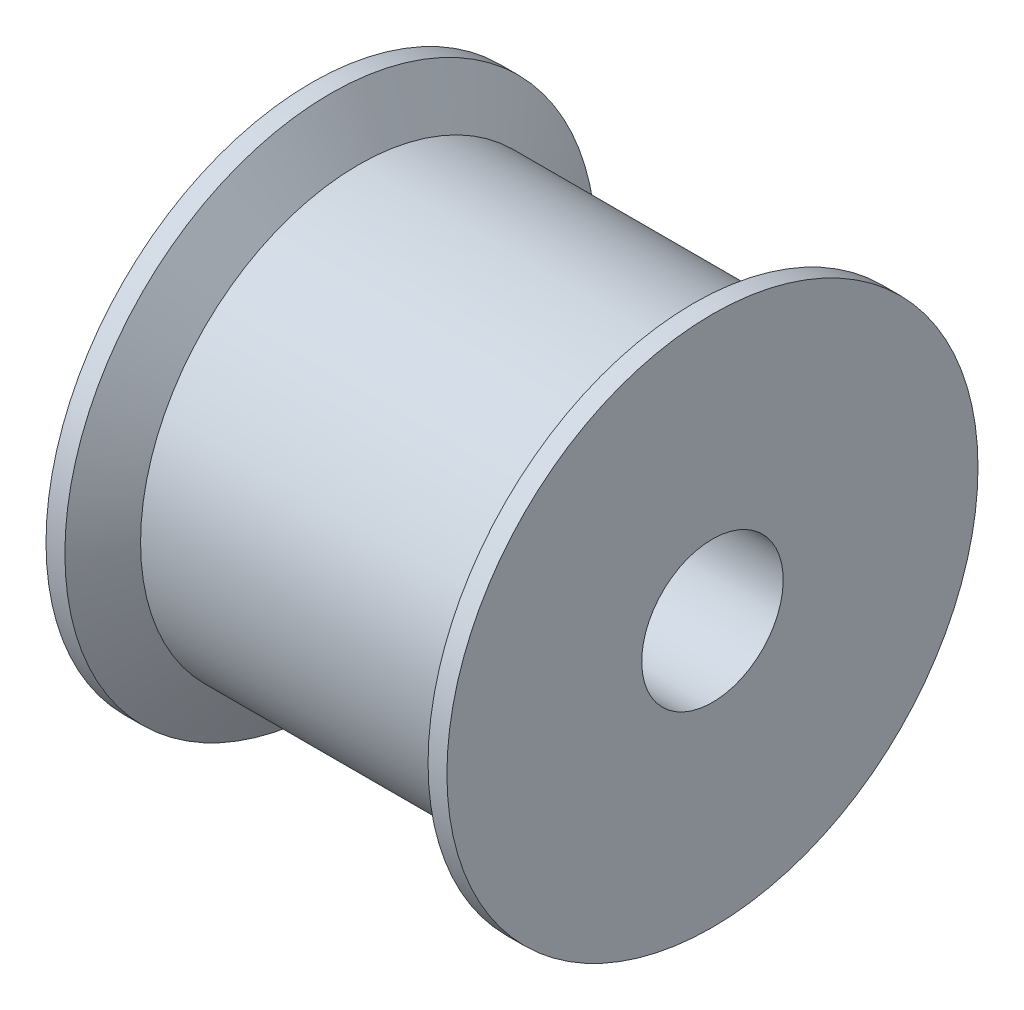
ISO-10303-21;
HEADER;
FILE_DESCRIPTION(('STEP AP214'),'2;1');
FILE_NAME('part.step','',(''),(''),'','','');
FILE_SCHEMA(('AUTOMOTIVE_DESIGN { 1 0 10303 214 1 1 1 1 }'));
ENDSEC;
DATA;
#1=APPLICATION_CONTEXT('core data for automotive mechanical design processes');
#2=APPLICATION_PROTOCOL_DEFINITION('international standard','automotive_design',2000,#1);
#3=PRODUCT_CONTEXT('',#1,'mechanical');
#4=PRODUCT('Part','Part','',(#3));
#5=PRODUCT_RELATED_PRODUCT_CATEGORY('part','',(#4));
#6=PRODUCT_DEFINITION_FORMATION('','',#4);
#7=PRODUCT_DEFINITION_CONTEXT('part definition',#1,'design');
#8=PRODUCT_DEFINITION('design','',#6,#7);
#9=PRODUCT_DEFINITION_SHAPE('','',#8);
#10=(LENGTH_UNIT() NAMED_UNIT(*) SI_UNIT(.MILLI.,.METRE.));
#11=(NAMED_UNIT(*) PLANE_ANGLE_UNIT() SI_UNIT($,.RADIAN.));
#12=(NAMED_UNIT(*) SI_UNIT($,.STERADIAN.) SOLID_ANGLE_UNIT());
#13=UNCERTAINTY_MEASURE_WITH_UNIT(LENGTH_MEASURE(1.E-05),#10,'distance_accuracy_value','');
#14=(GEOMETRIC_REPRESENTATION_CONTEXT(3) GLOBAL_UNCERTAINTY_ASSIGNED_CONTEXT((#13)) GLOBAL_UNIT_ASSIGNED_CONTEXT((#10,
#11,#12)) REPRESENTATION_CONTEXT('',''));
#15=CARTESIAN_POINT('',(0.,0.,0.));
#16=DIRECTION('',(0.,0.,1.));
#17=DIRECTION('',(1.,0.,0.));
#18=AXIS2_PLACEMENT_3D('',#15,#16,#17);
#19=CARTESIAN_POINT('',(0.,4.7352339497636,0.));
#20=DIRECTION('',(1.,0.,0.));
#21=DIRECTION('',(0.,1.,0.));
#22=AXIS2_PLACEMENT_3D('',#19,#20,#21);
#23=PLANE('',#22);
#24=CARTESIAN_POINT('',(0.,-0.894766050236404,0.));
#25=DIRECTION('',(1.,0.,0.));
#26=DIRECTION('',(0.,1.,0.));
#27=AXIS2_PLACEMENT_3D('',#24,#25,#26);
#28=CIRCLE('',#27,5.63);
#29=CARTESIAN_POINT('',(0.,4.7352339497636,0.));
#30=VERTEX_POINT('',#29);
#31=EDGE_CURVE('E10',#30,#30,#28,.T.);
#32=ORIENTED_EDGE('',*,*,#31,.T.);
#33=EDGE_LOOP('',(#32));
#34=FACE_BOUND('',#33,.T.);
#35=CARTESIAN_POINT('',(0.,-0.894766050236404,0.));
#36=DIRECTION('',(1.,0.,0.));
#37=DIRECTION('',(0.,1.,0.));
#38=AXIS2_PLACEMENT_3D('',#35,#36,#37);
#39=CIRCLE('',#38,1.5);
#40=CARTESIAN_POINT('',(0.,0.605233949763595,0.));
#41=VERTEX_POINT('',#40);
#42=EDGE_CURVE('E59',#41,#41,#39,.T.);
#43=ORIENTED_EDGE('',*,*,#42,.F.);
#44=EDGE_LOOP('',(#43));
#45=FACE_BOUND('',#44,.T.);
#46=ADVANCED_FACE('F31',(#34,#45),#23,.T.);
#47=CARTESIAN_POINT('',(10.310000758262,-0.894766050236403,0.));
#48=DIRECTION('',(1.,0.,0.));
#49=DIRECTION('',(0.,1.,0.));
#50=AXIS2_PLACEMENT_3D('',#47,#48,#49);
#51=CYLINDRICAL_SURFACE('',#50,5.63);
#52=CARTESIAN_POINT('',(-0.399999999999999,-0.894766050236404,0.));
#53=DIRECTION('',(1.,0.,0.));
#54=DIRECTION('',(0.,1.,0.));
#55=AXIS2_PLACEMENT_3D('',#52,#53,#54);
#56=CIRCLE('',#55,5.63);
#57=CARTESIAN_POINT('',(-0.4,4.7352339497636,0.));
#58=VERTEX_POINT('',#57);
#59=EDGE_CURVE('E37',#58,#58,#56,.T.);
#60=ORIENTED_EDGE('',*,*,#59,.T.);
#61=EDGE_LOOP('',(#60));
#62=FACE_BOUND('',#61,.T.);
#63=ORIENTED_EDGE('',*,*,#31,.F.);
#64=EDGE_LOOP('',(#63));
#65=FACE_BOUND('',#64,.T.);
#66=ADVANCED_FACE('F67',(#62,#65),#51,.T.);
#67=CARTESIAN_POINT('',(-0.399999999999999,-0.894766050236404,0.));
#68=DIRECTION('',(1.,0.,0.));
#69=DIRECTION('',(0.,1.,0.));
#70=AXIS2_PLACEMENT_3D('',#67,#68,#69);
#71=CONICAL_SURFACE('',#70,5.63,1.03257462518342);
#72=CARTESIAN_POINT('',(-1.,-0.894766050236404,0.));
#73=DIRECTION('',(1.,0.,0.));
#74=DIRECTION('',(0.,1.,0.));
#75=AXIS2_PLACEMENT_3D('',#72,#73,#74);
#76=CIRCLE('',#75,4.625);
#77=CARTESIAN_POINT('',(-1.,3.7302339497636,0.));
#78=VERTEX_POINT('',#77);
#79=EDGE_CURVE('E41',#78,#78,#76,.T.);
#80=ORIENTED_EDGE('',*,*,#79,.T.);
#81=EDGE_LOOP('',(#80));
#82=FACE_BOUND('',#81,.T.);
#83=ORIENTED_EDGE('',*,*,#59,.F.);
#84=EDGE_LOOP('',(#83));
#85=FACE_BOUND('',#84,.T.);
#86=ADVANCED_FACE('F71',(#82,#85),#71,.T.);
#87=CARTESIAN_POINT('',(10.310000758262,-0.894766050236403,0.));
#88=DIRECTION('',(1.,0.,0.));
#89=DIRECTION('',(0.,1.,0.));
#90=AXIS2_PLACEMENT_3D('',#87,#88,#89);
#91=CYLINDRICAL_SURFACE('',#90,4.625);
#92=CARTESIAN_POINT('',(-7.5,-0.894766050236405,0.));
#93=DIRECTION('',(1.,0.,0.));
#94=DIRECTION('',(0.,1.,0.));
#95=AXIS2_PLACEMENT_3D('',#92,#93,#94);
#96=CIRCLE('',#95,4.625);
#97=CARTESIAN_POINT('',(-7.5,3.7302339497636,0.));
#98=VERTEX_POINT('',#97);
#99=EDGE_CURVE('E45',#98,#98,#96,.T.);
#100=ORIENTED_EDGE('',*,*,#99,.T.);
#101=EDGE_LOOP('',(#100));
#102=FACE_BOUND('',#101,.T.);
#103=ORIENTED_EDGE('',*,*,#79,.F.);
#104=EDGE_LOOP('',(#103));
#105=FACE_BOUND('',#104,.T.);
#106=ADVANCED_FACE('F75',(#102,#105),#91,.T.);
#107=CARTESIAN_POINT('',(-7.5,-0.894766050236405,0.));
#108=DIRECTION('',(-1.,0.,0.));
#109=DIRECTION('',(0.,-1.,0.));
#110=AXIS2_PLACEMENT_3D('',#107,#108,#109);
#111=CONICAL_SURFACE('',#110,4.625,1.03257462518342);
#112=CARTESIAN_POINT('',(-8.1,-0.894766050236405,0.));
#113=DIRECTION('',(1.,0.,0.));
#114=DIRECTION('',(0.,1.,0.));
#115=AXIS2_PLACEMENT_3D('',#112,#113,#114);
#116=CIRCLE('',#115,5.63);
#117=CARTESIAN_POINT('',(-8.1,4.73523394976359,0.));
#118=VERTEX_POINT('',#117);
#119=EDGE_CURVE('E50',#118,#118,#116,.T.);
#120=ORIENTED_EDGE('',*,*,#119,.T.);
#121=EDGE_LOOP('',(#120));
#122=FACE_BOUND('',#121,.T.);
#123=ORIENTED_EDGE('',*,*,#99,.F.);
#124=EDGE_LOOP('',(#123));
#125=FACE_BOUND('',#124,.T.);
#126=ADVANCED_FACE('F82',(#122,#125),#111,.T.);
#127=CARTESIAN_POINT('',(10.310000758262,-0.894766050236403,0.));
#128=DIRECTION('',(1.,0.,0.));
#129=DIRECTION('',(0.,1.,0.));
#130=AXIS2_PLACEMENT_3D('',#127,#128,#129);
#131=CYLINDRICAL_SURFACE('',#130,5.63);
#132=CARTESIAN_POINT('',(-8.5,-0.894766050236405,0.));
#133=DIRECTION('',(1.,0.,0.));
#134=DIRECTION('',(0.,1.,0.));
#135=AXIS2_PLACEMENT_3D('',#132,#133,#134);
#136=CIRCLE('',#135,5.63);
#137=CARTESIAN_POINT('',(-8.5,4.73523394976359,0.));
#138=VERTEX_POINT('',#137);
#139=EDGE_CURVE('E53',#138,#138,#136,.T.);
#140=ORIENTED_EDGE('',*,*,#139,.T.);
#141=EDGE_LOOP('',(#140));
#142=FACE_BOUND('',#141,.T.);
#143=ORIENTED_EDGE('',*,*,#119,.F.);
#144=EDGE_LOOP('',(#143));
#145=FACE_BOUND('',#144,.T.);
#146=ADVANCED_FACE('F86',(#142,#145),#131,.T.);
#147=CARTESIAN_POINT('',(-8.5,0.605233949763595,0.));
#148=DIRECTION('',(-1.,0.,0.));
#149=DIRECTION('',(0.,-1.,0.));
#150=AXIS2_PLACEMENT_3D('',#147,#148,#149);
#151=PLANE('',#150);
#152=CARTESIAN_POINT('',(-8.5,-0.894766050236405,0.));
#153=DIRECTION('',(1.,0.,0.));
#154=DIRECTION('',(0.,1.,0.));
#155=AXIS2_PLACEMENT_3D('',#152,#153,#154);
#156=CIRCLE('',#155,1.5);
#157=CARTESIAN_POINT('',(-8.5,0.605233949763595,0.));
#158=VERTEX_POINT('',#157);
#159=EDGE_CURVE('E56',#158,#158,#156,.T.);
#160=ORIENTED_EDGE('',*,*,#159,.T.);
#161=EDGE_LOOP('',(#160));
#162=FACE_BOUND('',#161,.T.);
#163=ORIENTED_EDGE('',*,*,#139,.F.);
#164=EDGE_LOOP('',(#163));
#165=FACE_BOUND('',#164,.T.);
#166=ADVANCED_FACE('F90',(#162,#165),#151,.T.);
#167=CARTESIAN_POINT('',(10.310000758262,-0.894766050236403,0.));
#168=DIRECTION('',(1.,0.,0.));
#169=DIRECTION('',(0.,1.,0.));
#170=AXIS2_PLACEMENT_3D('',#167,#168,#169);
#171=CYLINDRICAL_SURFACE('',#170,1.5);
#172=ORIENTED_EDGE('',*,*,#42,.T.);
#173=EDGE_LOOP('',(#172));
#174=FACE_BOUND('',#173,.T.);
#175=ORIENTED_EDGE('',*,*,#159,.F.);
#176=EDGE_LOOP('',(#175));
#177=FACE_BOUND('',#176,.T.);
#178=ADVANCED_FACE('F63',(#174,#177),#171,.F.);
#179=CLOSED_SHELL('',(#46,#66,#86,#106,#126,#146,#166,#178));
#180=MANIFOLD_SOLID_BREP('B2',#179);
#181=ADVANCED_BREP_SHAPE_REPRESENTATION('',(#18,#180),#14);
#182=SHAPE_DEFINITION_REPRESENTATION(#9,#181);
ENDSEC;
END-ISO-10303-21;
